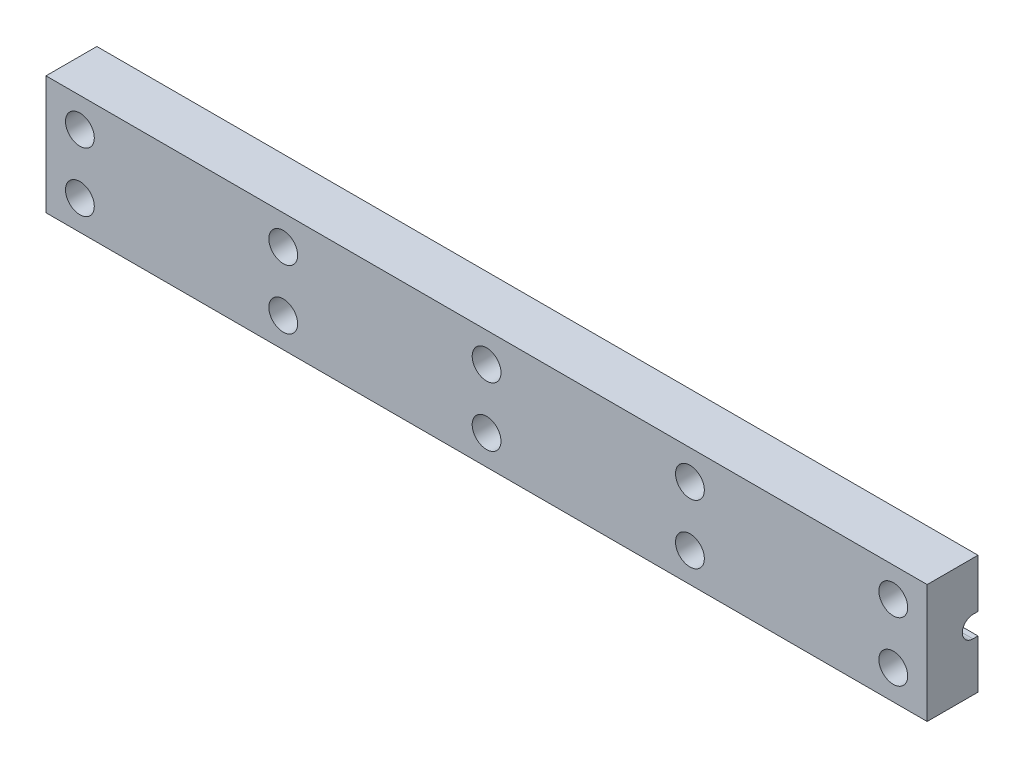
ISO-10303-21;
HEADER;
FILE_DESCRIPTION(('STEP AP214'),'2;1');
FILE_NAME('part.step','',(''),(''),'','','');
FILE_SCHEMA(('AUTOMOTIVE_DESIGN { 1 0 10303 214 1 1 1 1 }'));
ENDSEC;
DATA;
#1=APPLICATION_CONTEXT('core data for automotive mechanical design processes');
#2=APPLICATION_PROTOCOL_DEFINITION('international standard','automotive_design',2000,#1);
#3=PRODUCT_CONTEXT('',#1,'mechanical');
#4=PRODUCT('Part','Part','',(#3));
#5=PRODUCT_RELATED_PRODUCT_CATEGORY('part','',(#4));
#6=PRODUCT_DEFINITION_FORMATION('','',#4);
#7=PRODUCT_DEFINITION_CONTEXT('part definition',#1,'design');
#8=PRODUCT_DEFINITION('design','',#6,#7);
#9=PRODUCT_DEFINITION_SHAPE('','',#8);
#10=(LENGTH_UNIT() NAMED_UNIT(*) SI_UNIT(.MILLI.,.METRE.));
#11=(NAMED_UNIT(*) PLANE_ANGLE_UNIT() SI_UNIT($,.RADIAN.));
#12=(NAMED_UNIT(*) SI_UNIT($,.STERADIAN.) SOLID_ANGLE_UNIT());
#13=UNCERTAINTY_MEASURE_WITH_UNIT(LENGTH_MEASURE(1.E-05),#10,'distance_accuracy_value','');
#14=(GEOMETRIC_REPRESENTATION_CONTEXT(3) GLOBAL_UNCERTAINTY_ASSIGNED_CONTEXT((#13)) GLOBAL_UNIT_ASSIGNED_CONTEXT((#10,
#11,#12)) REPRESENTATION_CONTEXT('',''));
#15=CARTESIAN_POINT('',(0.,0.,0.));
#16=DIRECTION('',(0.,0.,1.));
#17=DIRECTION('',(1.,0.,0.));
#18=AXIS2_PLACEMENT_3D('',#15,#16,#17);
#19=CARTESIAN_POINT('',(170.645147999783,197.163538158501,246.970904960978));
#20=DIRECTION('',(0.,0.,1.));
#21=DIRECTION('',(1.,0.,0.));
#22=AXIS2_PLACEMENT_3D('',#19,#20,#21);
#23=PLANE('',#22);
#24=CARTESIAN_POINT('',(150.645147999783,197.6635381585,246.970904960979));
#25=DIRECTION('',(0.,0.,1.));
#26=DIRECTION('',(1.,0.,0.));
#27=AXIS2_PLACEMENT_3D('',#24,#25,#26);
#28=CIRCLE('',#27,1.70000000000001);
#29=CARTESIAN_POINT('',(152.345147999783,197.6635381585,246.970904960979));
#30=VERTEX_POINT('',#29);
#31=EDGE_CURVE('E223',#30,#30,#28,.T.);
#32=ORIENTED_EDGE('',*,*,#31,.F.);
#33=EDGE_LOOP('',(#32));
#34=FACE_BOUND('',#33,.T.);
#35=CARTESIAN_POINT('',(150.645147999783,204.663538158501,246.970904960979));
#36=DIRECTION('',(0.,0.,1.));
#37=DIRECTION('',(1.,0.,0.));
#38=AXIS2_PLACEMENT_3D('',#35,#36,#37);
#39=CIRCLE('',#38,1.70000000000001);
#40=CARTESIAN_POINT('',(152.345147999783,204.663538158501,246.970904960979));
#41=VERTEX_POINT('',#40);
#42=EDGE_CURVE('E131',#41,#41,#39,.T.);
#43=ORIENTED_EDGE('',*,*,#42,.F.);
#44=EDGE_LOOP('',(#43));
#45=FACE_BOUND('',#44,.T.);
#46=CARTESIAN_POINT('',(222.645147999783,197.663538158501,246.970904960979));
#47=DIRECTION('',(0.,0.,1.));
#48=DIRECTION('',(1.,0.,0.));
#49=AXIS2_PLACEMENT_3D('',#46,#47,#48);
#50=CIRCLE('',#49,1.70000000000001);
#51=CARTESIAN_POINT('',(224.345147999783,197.663538158501,246.970904960979));
#52=VERTEX_POINT('',#51);
#53=EDGE_CURVE('E157',#52,#52,#50,.T.);
#54=ORIENTED_EDGE('',*,*,#53,.F.);
#55=EDGE_LOOP('',(#54));
#56=FACE_BOUND('',#55,.T.);
#57=CARTESIAN_POINT('',(246.645147999783,197.663538158501,246.970904960979));
#58=DIRECTION('',(0.,0.,1.));
#59=DIRECTION('',(1.,0.,0.));
#60=AXIS2_PLACEMENT_3D('',#57,#58,#59);
#61=CIRCLE('',#60,1.70000000000001);
#62=CARTESIAN_POINT('',(248.345147999783,197.663538158501,246.970904960979));
#63=VERTEX_POINT('',#62);
#64=EDGE_CURVE('E161',#63,#63,#61,.T.);
#65=ORIENTED_EDGE('',*,*,#64,.F.);
#66=EDGE_LOOP('',(#65));
#67=FACE_BOUND('',#66,.T.);
#68=CARTESIAN_POINT('',(222.645147999783,204.663538158501,246.970904960979));
#69=DIRECTION('',(0.,0.,1.));
#70=DIRECTION('',(1.,0.,0.));
#71=AXIS2_PLACEMENT_3D('',#68,#69,#70);
#72=CIRCLE('',#71,1.70000000000001);
#73=CARTESIAN_POINT('',(224.345147999783,204.663538158501,246.970904960979));
#74=VERTEX_POINT('',#73);
#75=EDGE_CURVE('E154',#74,#74,#72,.F.);
#76=ORIENTED_EDGE('',*,*,#75,.T.);
#77=EDGE_LOOP('',(#76));
#78=FACE_BOUND('',#77,.T.);
#79=CARTESIAN_POINT('',(246.645147999783,204.663538158501,246.970904960979));
#80=DIRECTION('',(0.,0.,1.));
#81=DIRECTION('',(1.,0.,0.));
#82=AXIS2_PLACEMENT_3D('',#79,#80,#81);
#83=CIRCLE('',#82,1.70000000000001);
#84=CARTESIAN_POINT('',(248.345147999783,204.663538158501,246.970904960979));
#85=VERTEX_POINT('',#84);
#86=EDGE_CURVE('E151',#85,#85,#83,.F.);
#87=ORIENTED_EDGE('',*,*,#86,.T.);
#88=EDGE_LOOP('',(#87));
#89=FACE_BOUND('',#88,.T.);
#90=CARTESIAN_POINT('',(198.645147999783,197.663538158501,246.970904960979));
#91=DIRECTION('',(0.,0.,1.));
#92=DIRECTION('',(1.,0.,0.));
#93=AXIS2_PLACEMENT_3D('',#90,#91,#92);
#94=CIRCLE('',#93,1.70000000000001);
#95=CARTESIAN_POINT('',(200.345147999783,197.663538158501,246.970904960979));
#96=VERTEX_POINT('',#95);
#97=EDGE_CURVE('E160',#96,#96,#94,.T.);
#98=ORIENTED_EDGE('',*,*,#97,.F.);
#99=EDGE_LOOP('',(#98));
#100=FACE_BOUND('',#99,.T.);
#101=DIRECTION('',(1.,0.,0.));
#102=VECTOR('',#101,1.);
#103=CARTESIAN_POINT('',(170.645147999783,194.163538158501,246.970904960978));
#104=LINE('',#103,#102);
#105=CARTESIAN_POINT('',(146.645147999783,194.163538158501,246.970904960978));
#106=VERTEX_POINT('',#105);
#107=CARTESIAN_POINT('',(250.645147999783,194.163538158501,246.970904960978));
#108=VERTEX_POINT('',#107);
#109=EDGE_CURVE('E113',#106,#108,#104,.T.);
#110=ORIENTED_EDGE('',*,*,#109,.T.);
#111=DIRECTION('',(0.,-1.,0.));
#112=VECTOR('',#111,1.);
#113=CARTESIAN_POINT('',(250.645147999783,208.163538158501,246.970904960978));
#114=LINE('',#113,#112);
#115=CARTESIAN_POINT('',(250.645147999783,208.163538158501,246.970904960978));
#116=VERTEX_POINT('',#115);
#117=EDGE_CURVE('E109',#116,#108,#114,.T.);
#118=ORIENTED_EDGE('',*,*,#117,.F.);
#119=DIRECTION('',(1.,0.,0.));
#120=VECTOR('',#119,1.);
#121=CARTESIAN_POINT('',(170.645147999783,208.163538158501,246.970904960978));
#122=LINE('',#121,#120);
#123=CARTESIAN_POINT('',(146.645147999783,208.163538158501,246.970904960978));
#124=VERTEX_POINT('',#123);
#125=EDGE_CURVE('E103',#124,#116,#122,.T.);
#126=ORIENTED_EDGE('',*,*,#125,.F.);
#127=DIRECTION('',(0.,1.,0.));
#128=VECTOR('',#127,1.);
#129=CARTESIAN_POINT('',(146.645147999783,194.163538158501,246.970904960978));
#130=LINE('',#129,#128);
#131=EDGE_CURVE('E107',#106,#124,#130,.T.);
#132=ORIENTED_EDGE('',*,*,#131,.F.);
#133=EDGE_LOOP('',(#110,#118,#126,#132));
#134=FACE_BOUND('',#133,.T.);
#135=CARTESIAN_POINT('',(174.645147999783,197.6635381585,246.970904960979));
#136=DIRECTION('',(0.,0.,1.));
#137=DIRECTION('',(1.,0.,0.));
#138=AXIS2_PLACEMENT_3D('',#135,#136,#137);
#139=CIRCLE('',#138,1.70000000000001);
#140=CARTESIAN_POINT('',(176.345147999783,197.6635381585,246.970904960979));
#141=VERTEX_POINT('',#140);
#142=EDGE_CURVE('E150',#141,#141,#139,.T.);
#143=ORIENTED_EDGE('',*,*,#142,.F.);
#144=EDGE_LOOP('',(#143));
#145=FACE_BOUND('',#144,.T.);
#146=CARTESIAN_POINT('',(198.645147999783,204.663538158501,246.970904960979));
#147=DIRECTION('',(0.,0.,-1.));
#148=DIRECTION('',(-1.,0.,0.));
#149=AXIS2_PLACEMENT_3D('',#146,#147,#148);
#150=CIRCLE('',#149,1.70000000000001);
#151=CARTESIAN_POINT('',(196.945147999783,204.663538158501,246.970904960979));
#152=VERTEX_POINT('',#151);
#153=EDGE_CURVE('E147',#152,#152,#150,.T.);
#154=ORIENTED_EDGE('',*,*,#153,.T.);
#155=EDGE_LOOP('',(#154));
#156=FACE_BOUND('',#155,.T.);
#157=CARTESIAN_POINT('',(174.645147999783,204.663538158501,246.970904960979));
#158=DIRECTION('',(0.,0.,1.));
#159=DIRECTION('',(1.,0.,0.));
#160=AXIS2_PLACEMENT_3D('',#157,#158,#159);
#161=CIRCLE('',#160,1.70000000000001);
#162=CARTESIAN_POINT('',(176.345147999783,204.663538158501,246.970904960979));
#163=VERTEX_POINT('',#162);
#164=EDGE_CURVE('E164',#163,#163,#161,.F.);
#165=ORIENTED_EDGE('',*,*,#164,.T.);
#166=EDGE_LOOP('',(#165));
#167=FACE_BOUND('',#166,.T.);
#168=ADVANCED_FACE('F37',(#34,#45,#56,#67,#78,#89,#100,#134,#145,#156,#167),#23,.T.);
#169=CARTESIAN_POINT('',(170.645147999783,208.163538158501,240.970904960978));
#170=DIRECTION('',(0.,1.,0.));
#171=DIRECTION('',(0.,0.,1.));
#172=AXIS2_PLACEMENT_3D('',#169,#170,#171);
#173=PLANE('',#172);
#174=ORIENTED_EDGE('',*,*,#125,.T.);
#175=DIRECTION('',(0.,0.,1.));
#176=VECTOR('',#175,1.);
#177=CARTESIAN_POINT('',(250.645147999783,208.163538158501,240.970904960978));
#178=LINE('',#177,#176);
#179=CARTESIAN_POINT('',(250.645147999783,208.163538158501,240.970904960978));
#180=VERTEX_POINT('',#179);
#181=EDGE_CURVE('E195',#180,#116,#178,.T.);
#182=ORIENTED_EDGE('',*,*,#181,.F.);
#183=DIRECTION('',(1.,0.,0.));
#184=VECTOR('',#183,1.);
#185=CARTESIAN_POINT('',(170.645147999783,208.163538158501,240.970904960978));
#186=LINE('',#185,#184);
#187=CARTESIAN_POINT('',(146.645147999783,208.163538158501,240.970904960978));
#188=VERTEX_POINT('',#187);
#189=EDGE_CURVE('E11',#188,#180,#186,.T.);
#190=ORIENTED_EDGE('',*,*,#189,.F.);
#191=DIRECTION('',(0.,0.,-1.));
#192=VECTOR('',#191,1.);
#193=CARTESIAN_POINT('',(146.645147999783,208.163538158501,246.970904960978));
#194=LINE('',#193,#192);
#195=EDGE_CURVE('E117',#124,#188,#194,.T.);
#196=ORIENTED_EDGE('',*,*,#195,.F.);
#197=EDGE_LOOP('',(#174,#182,#190,#196));
#198=FACE_BOUND('',#197,.T.);
#199=ADVANCED_FACE('F39',(#198),#173,.T.);
#200=CARTESIAN_POINT('',(170.645147999783,205.163538158501,240.970904960978));
#201=DIRECTION('',(0.,0.,-1.));
#202=DIRECTION('',(-1.,0.,0.));
#203=AXIS2_PLACEMENT_3D('',#200,#201,#202);
#204=PLANE('',#203);
#205=CARTESIAN_POINT('',(150.645147999783,204.663538158501,240.970904960978));
#206=DIRECTION('',(0.,0.,-1.));
#207=DIRECTION('',(-1.,0.,0.));
#208=AXIS2_PLACEMENT_3D('',#205,#206,#207);
#209=CIRCLE('',#208,1.70000000000001);
#210=CARTESIAN_POINT('',(148.945147999783,204.663538158501,240.970904960978));
#211=VERTEX_POINT('',#210);
#212=EDGE_CURVE('E41',#211,#211,#209,.T.);
#213=ORIENTED_EDGE('',*,*,#212,.F.);
#214=EDGE_LOOP('',(#213));
#215=FACE_BOUND('',#214,.T.);
#216=CARTESIAN_POINT('',(174.645147999783,204.663538158501,240.970904960978));
#217=DIRECTION('',(0.,0.,-1.));
#218=DIRECTION('',(-1.,0.,0.));
#219=AXIS2_PLACEMENT_3D('',#216,#217,#218);
#220=CIRCLE('',#219,1.70000000000001);
#221=CARTESIAN_POINT('',(172.945147999783,204.663538158501,240.970904960978));
#222=VERTEX_POINT('',#221);
#223=EDGE_CURVE('E186',#222,#222,#220,.F.);
#224=ORIENTED_EDGE('',*,*,#223,.T.);
#225=EDGE_LOOP('',(#224));
#226=FACE_BOUND('',#225,.T.);
#227=CARTESIAN_POINT('',(222.645147999783,204.663538158501,240.970904960978));
#228=DIRECTION('',(0.,0.,-1.));
#229=DIRECTION('',(-1.,0.,0.));
#230=AXIS2_PLACEMENT_3D('',#227,#228,#229);
#231=CIRCLE('',#230,1.70000000000001);
#232=CARTESIAN_POINT('',(220.945147999783,204.663538158501,240.970904960978));
#233=VERTEX_POINT('',#232);
#234=EDGE_CURVE('E183',#233,#233,#231,.F.);
#235=ORIENTED_EDGE('',*,*,#234,.T.);
#236=EDGE_LOOP('',(#235));
#237=FACE_BOUND('',#236,.T.);
#238=CARTESIAN_POINT('',(198.645147999783,204.663538158501,240.970904960978));
#239=DIRECTION('',(0.,0.,-1.));
#240=DIRECTION('',(-1.,0.,0.));
#241=AXIS2_PLACEMENT_3D('',#238,#239,#240);
#242=CIRCLE('',#241,1.70000000000001);
#243=CARTESIAN_POINT('',(196.945147999783,204.663538158501,240.970904960978));
#244=VERTEX_POINT('',#243);
#245=EDGE_CURVE('E180',#244,#244,#242,.F.);
#246=ORIENTED_EDGE('',*,*,#245,.T.);
#247=EDGE_LOOP('',(#246));
#248=FACE_BOUND('',#247,.T.);
#249=CARTESIAN_POINT('',(246.645147999783,204.663538158501,240.970904960978));
#250=DIRECTION('',(0.,0.,-1.));
#251=DIRECTION('',(-1.,0.,0.));
#252=AXIS2_PLACEMENT_3D('',#249,#250,#251);
#253=CIRCLE('',#252,1.70000000000001);
#254=CARTESIAN_POINT('',(244.945147999783,204.663538158501,240.970904960978));
#255=VERTEX_POINT('',#254);
#256=EDGE_CURVE('E174',#255,#255,#253,.F.);
#257=ORIENTED_EDGE('',*,*,#256,.T.);
#258=EDGE_LOOP('',(#257));
#259=FACE_BOUND('',#258,.T.);
#260=ORIENTED_EDGE('',*,*,#189,.T.);
#261=DIRECTION('',(0.,1.,0.));
#262=VECTOR('',#261,1.);
#263=CARTESIAN_POINT('',(250.645147999783,202.413538158492,240.970904960978));
#264=LINE('',#263,#262);
#265=CARTESIAN_POINT('',(250.645147999783,202.413538158492,240.970904960978));
#266=VERTEX_POINT('',#265);
#267=EDGE_CURVE('E114',#266,#180,#264,.T.);
#268=ORIENTED_EDGE('',*,*,#267,.F.);
#269=DIRECTION('',(1.,0.,0.));
#270=VECTOR('',#269,1.);
#271=CARTESIAN_POINT('',(170.645147999783,202.413538158492,240.970904960978));
#272=LINE('',#271,#270);
#273=CARTESIAN_POINT('',(146.645147999783,202.413538158492,240.970904960978));
#274=VERTEX_POINT('',#273);
#275=EDGE_CURVE('E46',#274,#266,#272,.T.);
#276=ORIENTED_EDGE('',*,*,#275,.F.);
#277=DIRECTION('',(0.,-1.,0.));
#278=VECTOR('',#277,1.);
#279=CARTESIAN_POINT('',(146.645147999783,208.163538158501,240.970904960978));
#280=LINE('',#279,#278);
#281=EDGE_CURVE('E120',#188,#274,#280,.T.);
#282=ORIENTED_EDGE('',*,*,#281,.F.);
#283=EDGE_LOOP('',(#260,#268,#276,#282));
#284=FACE_BOUND('',#283,.T.);
#285=ADVANCED_FACE('F267',(#215,#226,#237,#248,#259,#284),#204,.T.);
#286=CARTESIAN_POINT('',(170.645147999783,202.413538158492,241.570904954906));
#287=DIRECTION('',(0.,-1.,0.));
#288=DIRECTION('',(0.,0.,-1.));
#289=AXIS2_PLACEMENT_3D('',#286,#287,#288);
#290=PLANE('',#289);
#291=ORIENTED_EDGE('',*,*,#275,.T.);
#292=DIRECTION('',(0.,0.,-1.));
#293=VECTOR('',#292,1.);
#294=CARTESIAN_POINT('',(250.645147999783,202.413538158492,241.570904954906));
#295=LINE('',#294,#293);
#296=CARTESIAN_POINT('',(250.645147999783,202.413538158492,241.570904954906));
#297=VERTEX_POINT('',#296);
#298=EDGE_CURVE('E210',#297,#266,#295,.T.);
#299=ORIENTED_EDGE('',*,*,#298,.F.);
#300=DIRECTION('',(1.,0.,0.));
#301=VECTOR('',#300,1.);
#302=CARTESIAN_POINT('',(170.645147999783,202.413538158492,241.570904954906));
#303=LINE('',#302,#301);
#304=CARTESIAN_POINT('',(146.645147999783,202.413538158492,241.570904954906));
#305=VERTEX_POINT('',#304);
#306=EDGE_CURVE('E214',#305,#297,#303,.T.);
#307=ORIENTED_EDGE('',*,*,#306,.F.);
#308=DIRECTION('',(0.,0.,1.));
#309=VECTOR('',#308,1.);
#310=CARTESIAN_POINT('',(146.645147999783,202.413538158492,240.970904960978));
#311=LINE('',#310,#309);
#312=EDGE_CURVE('E135',#274,#305,#311,.T.);
#313=ORIENTED_EDGE('',*,*,#312,.F.);
#314=EDGE_LOOP('',(#291,#299,#307,#313));
#315=FACE_BOUND('',#314,.T.);
#316=ADVANCED_FACE('F270',(#315),#290,.T.);
#317=CARTESIAN_POINT('',(170.645147999783,201.163538158492,241.570904960977));
#318=DIRECTION('',(1.,0.,0.));
#319=DIRECTION('',(0.,0.,-1.));
#320=AXIS2_PLACEMENT_3D('',#317,#318,#319);
#321=CYLINDRICAL_SURFACE('',#320,1.25);
#322=ORIENTED_EDGE('',*,*,#306,.T.);
#323=CARTESIAN_POINT('',(250.645147999783,201.163538158492,241.570904960977));
#324=DIRECTION('',(-1.,0.,0.));
#325=DIRECTION('',(0.,0.,-1.));
#326=AXIS2_PLACEMENT_3D('',#323,#324,#325);
#327=CIRCLE('',#326,1.25);
#328=CARTESIAN_POINT('',(250.645147999783,199.913538158492,241.570904960977));
#329=VERTEX_POINT('',#328);
#330=EDGE_CURVE('E207',#329,#297,#327,.T.);
#331=ORIENTED_EDGE('',*,*,#330,.F.);
#332=DIRECTION('',(1.,0.,0.));
#333=VECTOR('',#332,1.);
#334=CARTESIAN_POINT('',(170.645147999783,199.913538158492,241.570904960977));
#335=LINE('',#334,#333);
#336=CARTESIAN_POINT('',(146.645147999783,199.913538158492,241.570904960977));
#337=VERTEX_POINT('',#336);
#338=EDGE_CURVE('E216',#337,#329,#335,.T.);
#339=ORIENTED_EDGE('',*,*,#338,.F.);
#340=CARTESIAN_POINT('',(146.645147999783,201.163538158492,241.570904960977));
#341=DIRECTION('',(1.,0.,0.));
#342=DIRECTION('',(0.,0.,1.));
#343=AXIS2_PLACEMENT_3D('',#340,#341,#342);
#344=CIRCLE('',#343,1.25);
#345=EDGE_CURVE('E138',#305,#337,#344,.T.);
#346=ORIENTED_EDGE('',*,*,#345,.F.);
#347=EDGE_LOOP('',(#322,#331,#339,#346));
#348=FACE_BOUND('',#347,.T.);
#349=ADVANCED_FACE('F274',(#348),#321,.F.);
#350=CARTESIAN_POINT('',(170.645147999783,199.913538158492,240.970904960978));
#351=DIRECTION('',(0.,1.,0.));
#352=DIRECTION('',(0.,0.,1.));
#353=AXIS2_PLACEMENT_3D('',#350,#351,#352);
#354=PLANE('',#353);
#355=ORIENTED_EDGE('',*,*,#338,.T.);
#356=DIRECTION('',(0.,0.,1.));
#357=VECTOR('',#356,1.);
#358=CARTESIAN_POINT('',(250.645147999783,199.913538158492,240.970904960978));
#359=LINE('',#358,#357);
#360=CARTESIAN_POINT('',(250.645147999783,199.913538158492,240.970904960978));
#361=VERTEX_POINT('',#360);
#362=EDGE_CURVE('E204',#361,#329,#359,.T.);
#363=ORIENTED_EDGE('',*,*,#362,.F.);
#364=DIRECTION('',(1.,0.,0.));
#365=VECTOR('',#364,1.);
#366=CARTESIAN_POINT('',(170.645147999783,199.913538158492,240.970904960978));
#367=LINE('',#366,#365);
#368=CARTESIAN_POINT('',(146.645147999783,199.913538158492,240.970904960978));
#369=VERTEX_POINT('',#368);
#370=EDGE_CURVE('E218',#369,#361,#367,.T.);
#371=ORIENTED_EDGE('',*,*,#370,.F.);
#372=DIRECTION('',(0.,0.,-1.));
#373=VECTOR('',#372,1.);
#374=CARTESIAN_POINT('',(146.645147999783,199.913538158492,241.570904960977));
#375=LINE('',#374,#373);
#376=EDGE_CURVE('E141',#337,#369,#375,.T.);
#377=ORIENTED_EDGE('',*,*,#376,.F.);
#378=EDGE_LOOP('',(#355,#363,#371,#377));
#379=FACE_BOUND('',#378,.T.);
#380=ADVANCED_FACE('F277',(#379),#354,.T.);
#381=CARTESIAN_POINT('',(170.645147999783,197.163538158501,240.970904960978));
#382=DIRECTION('',(0.,0.,-1.));
#383=DIRECTION('',(-1.,0.,0.));
#384=AXIS2_PLACEMENT_3D('',#381,#382,#383);
#385=PLANE('',#384);
#386=CARTESIAN_POINT('',(150.645147999783,197.6635381585,240.970904960978));
#387=DIRECTION('',(0.,0.,-1.));
#388=DIRECTION('',(-1.,0.,0.));
#389=AXIS2_PLACEMENT_3D('',#386,#387,#388);
#390=CIRCLE('',#389,1.70000000000001);
#391=CARTESIAN_POINT('',(148.945147999783,197.6635381585,240.970904960978));
#392=VERTEX_POINT('',#391);
#393=EDGE_CURVE('E129',#392,#392,#390,.T.);
#394=ORIENTED_EDGE('',*,*,#393,.F.);
#395=EDGE_LOOP('',(#394));
#396=FACE_BOUND('',#395,.T.);
#397=CARTESIAN_POINT('',(222.645147999783,197.663538158501,240.970904960978));
#398=DIRECTION('',(0.,0.,-1.));
#399=DIRECTION('',(-1.,0.,0.));
#400=AXIS2_PLACEMENT_3D('',#397,#398,#399);
#401=CIRCLE('',#400,1.70000000000001);
#402=CARTESIAN_POINT('',(220.945147999783,197.663538158501,240.970904960978));
#403=VERTEX_POINT('',#402);
#404=EDGE_CURVE('E192',#403,#403,#401,.T.);
#405=ORIENTED_EDGE('',*,*,#404,.F.);
#406=EDGE_LOOP('',(#405));
#407=FACE_BOUND('',#406,.T.);
#408=CARTESIAN_POINT('',(246.645147999783,197.663538158501,240.970904960978));
#409=DIRECTION('',(0.,0.,-1.));
#410=DIRECTION('',(-1.,0.,0.));
#411=AXIS2_PLACEMENT_3D('',#408,#409,#410);
#412=CIRCLE('',#411,1.70000000000001);
#413=CARTESIAN_POINT('',(244.945147999783,197.663538158501,240.970904960978));
#414=VERTEX_POINT('',#413);
#415=EDGE_CURVE('E189',#414,#414,#412,.T.);
#416=ORIENTED_EDGE('',*,*,#415,.F.);
#417=EDGE_LOOP('',(#416));
#418=FACE_BOUND('',#417,.T.);
#419=CARTESIAN_POINT('',(174.645147999783,197.6635381585,240.970904960978));
#420=DIRECTION('',(0.,0.,-1.));
#421=DIRECTION('',(-1.,0.,0.));
#422=AXIS2_PLACEMENT_3D('',#419,#420,#421);
#423=CIRCLE('',#422,1.70000000000001);
#424=CARTESIAN_POINT('',(172.945147999783,197.6635381585,240.970904960978));
#425=VERTEX_POINT('',#424);
#426=EDGE_CURVE('E177',#425,#425,#423,.T.);
#427=ORIENTED_EDGE('',*,*,#426,.F.);
#428=EDGE_LOOP('',(#427));
#429=FACE_BOUND('',#428,.T.);
#430=CARTESIAN_POINT('',(198.645147999783,197.663538158501,240.970904960978));
#431=DIRECTION('',(0.,0.,-1.));
#432=DIRECTION('',(-1.,0.,0.));
#433=AXIS2_PLACEMENT_3D('',#430,#431,#432);
#434=CIRCLE('',#433,1.70000000000001);
#435=CARTESIAN_POINT('',(196.945147999783,197.663538158501,240.970904960978));
#436=VERTEX_POINT('',#435);
#437=EDGE_CURVE('E171',#436,#436,#434,.T.);
#438=ORIENTED_EDGE('',*,*,#437,.F.);
#439=EDGE_LOOP('',(#438));
#440=FACE_BOUND('',#439,.T.);
#441=ORIENTED_EDGE('',*,*,#370,.T.);
#442=DIRECTION('',(0.,1.,0.));
#443=VECTOR('',#442,1.);
#444=CARTESIAN_POINT('',(250.645147999783,194.163538158501,240.970904960978));
#445=LINE('',#444,#443);
#446=CARTESIAN_POINT('',(250.645147999783,194.163538158501,240.970904960978));
#447=VERTEX_POINT('',#446);
#448=EDGE_CURVE('E201',#447,#361,#445,.T.);
#449=ORIENTED_EDGE('',*,*,#448,.F.);
#450=DIRECTION('',(1.,0.,0.));
#451=VECTOR('',#450,1.);
#452=CARTESIAN_POINT('',(170.645147999783,194.163538158501,240.970904960978));
#453=LINE('',#452,#451);
#454=CARTESIAN_POINT('',(146.645147999783,194.163538158501,240.970904960978));
#455=VERTEX_POINT('',#454);
#456=EDGE_CURVE('E220',#455,#447,#453,.T.);
#457=ORIENTED_EDGE('',*,*,#456,.F.);
#458=DIRECTION('',(0.,-1.,0.));
#459=VECTOR('',#458,1.);
#460=CARTESIAN_POINT('',(146.645147999783,199.913538158492,240.970904960978));
#461=LINE('',#460,#459);
#462=EDGE_CURVE('E144',#369,#455,#461,.T.);
#463=ORIENTED_EDGE('',*,*,#462,.F.);
#464=EDGE_LOOP('',(#441,#449,#457,#463));
#465=FACE_BOUND('',#464,.T.);
#466=ADVANCED_FACE('F281',(#396,#407,#418,#429,#440,#465),#385,.T.);
#467=CARTESIAN_POINT('',(170.645147999783,194.163538158501,246.970904960978));
#468=DIRECTION('',(0.,-1.,0.));
#469=DIRECTION('',(0.,0.,-1.));
#470=AXIS2_PLACEMENT_3D('',#467,#468,#469);
#471=PLANE('',#470);
#472=ORIENTED_EDGE('',*,*,#456,.T.);
#473=DIRECTION('',(0.,0.,-1.));
#474=VECTOR('',#473,1.);
#475=CARTESIAN_POINT('',(250.645147999783,194.163538158501,246.970904960978));
#476=LINE('',#475,#474);
#477=EDGE_CURVE('E198',#108,#447,#476,.T.);
#478=ORIENTED_EDGE('',*,*,#477,.F.);
#479=ORIENTED_EDGE('',*,*,#109,.F.);
#480=DIRECTION('',(0.,0.,1.));
#481=VECTOR('',#480,1.);
#482=CARTESIAN_POINT('',(146.645147999783,194.163538158501,240.970904960978));
#483=LINE('',#482,#481);
#484=EDGE_CURVE('E126',#455,#106,#483,.T.);
#485=ORIENTED_EDGE('',*,*,#484,.F.);
#486=EDGE_LOOP('',(#472,#478,#479,#485));
#487=FACE_BOUND('',#486,.T.);
#488=ADVANCED_FACE('F260',(#487),#471,.T.);
#489=CARTESIAN_POINT('',(250.645147999783,201.163538158492,241.570904960977));
#490=DIRECTION('',(1.,0.,0.));
#491=DIRECTION('',(0.,0.,-1.));
#492=AXIS2_PLACEMENT_3D('',#489,#490,#491);
#493=PLANE('',#492);
#494=ORIENTED_EDGE('',*,*,#181,.T.);
#495=ORIENTED_EDGE('',*,*,#117,.T.);
#496=ORIENTED_EDGE('',*,*,#477,.T.);
#497=ORIENTED_EDGE('',*,*,#448,.T.);
#498=ORIENTED_EDGE('',*,*,#362,.T.);
#499=ORIENTED_EDGE('',*,*,#330,.T.);
#500=ORIENTED_EDGE('',*,*,#298,.T.);
#501=ORIENTED_EDGE('',*,*,#267,.T.);
#502=EDGE_LOOP('',(#494,#495,#496,#497,#498,#499,#500,#501));
#503=FACE_BOUND('',#502,.T.);
#504=ADVANCED_FACE('F250',(#503),#493,.T.);
#505=CARTESIAN_POINT('',(198.645147999783,197.663538158501,236.970904960979));
#506=DIRECTION('',(0.,0.,1.));
#507=DIRECTION('',(1.,0.,0.));
#508=AXIS2_PLACEMENT_3D('',#505,#506,#507);
#509=CYLINDRICAL_SURFACE('',#508,1.70000000000001);
#510=ORIENTED_EDGE('',*,*,#437,.T.);
#511=EDGE_LOOP('',(#510));
#512=FACE_BOUND('',#511,.T.);
#513=ORIENTED_EDGE('',*,*,#97,.T.);
#514=EDGE_LOOP('',(#513));
#515=FACE_BOUND('',#514,.T.);
#516=ADVANCED_FACE('F247',(#512,#515),#509,.F.);
#517=CARTESIAN_POINT('',(246.645147999783,204.663538158501,236.970904960979));
#518=DIRECTION('',(0.,0.,1.));
#519=DIRECTION('',(1.,0.,0.));
#520=AXIS2_PLACEMENT_3D('',#517,#518,#519);
#521=CYLINDRICAL_SURFACE('',#520,1.70000000000001);
#522=ORIENTED_EDGE('',*,*,#256,.F.);
#523=EDGE_LOOP('',(#522));
#524=FACE_BOUND('',#523,.T.);
#525=ORIENTED_EDGE('',*,*,#86,.F.);
#526=EDGE_LOOP('',(#525));
#527=FACE_BOUND('',#526,.T.);
#528=ADVANCED_FACE('F249',(#524,#527),#521,.F.);
#529=CARTESIAN_POINT('',(174.645147999783,197.6635381585,236.970904960979));
#530=DIRECTION('',(0.,0.,1.));
#531=DIRECTION('',(1.,0.,0.));
#532=AXIS2_PLACEMENT_3D('',#529,#530,#531);
#533=CYLINDRICAL_SURFACE('',#532,1.70000000000001);
#534=ORIENTED_EDGE('',*,*,#426,.T.);
#535=EDGE_LOOP('',(#534));
#536=FACE_BOUND('',#535,.T.);
#537=ORIENTED_EDGE('',*,*,#142,.T.);
#538=EDGE_LOOP('',(#537));
#539=FACE_BOUND('',#538,.T.);
#540=ADVANCED_FACE('F257',(#536,#539),#533,.F.);
#541=CARTESIAN_POINT('',(198.645147999783,204.663538158501,236.970904960979));
#542=DIRECTION('',(0.,0.,1.));
#543=DIRECTION('',(1.,0.,0.));
#544=AXIS2_PLACEMENT_3D('',#541,#542,#543);
#545=CYLINDRICAL_SURFACE('',#544,1.70000000000001);
#546=ORIENTED_EDGE('',*,*,#245,.F.);
#547=EDGE_LOOP('',(#546));
#548=FACE_BOUND('',#547,.T.);
#549=ORIENTED_EDGE('',*,*,#153,.F.);
#550=EDGE_LOOP('',(#549));
#551=FACE_BOUND('',#550,.T.);
#552=ADVANCED_FACE('F328',(#548,#551),#545,.F.);
#553=CARTESIAN_POINT('',(222.645147999783,204.663538158501,236.970904960979));
#554=DIRECTION('',(0.,0.,1.));
#555=DIRECTION('',(1.,0.,0.));
#556=AXIS2_PLACEMENT_3D('',#553,#554,#555);
#557=CYLINDRICAL_SURFACE('',#556,1.70000000000001);
#558=ORIENTED_EDGE('',*,*,#234,.F.);
#559=EDGE_LOOP('',(#558));
#560=FACE_BOUND('',#559,.T.);
#561=ORIENTED_EDGE('',*,*,#75,.F.);
#562=EDGE_LOOP('',(#561));
#563=FACE_BOUND('',#562,.T.);
#564=ADVANCED_FACE('F264',(#560,#563),#557,.F.);
#565=CARTESIAN_POINT('',(174.645147999783,204.663538158501,236.970904960979));
#566=DIRECTION('',(0.,0.,1.));
#567=DIRECTION('',(1.,0.,0.));
#568=AXIS2_PLACEMENT_3D('',#565,#566,#567);
#569=CYLINDRICAL_SURFACE('',#568,1.70000000000001);
#570=ORIENTED_EDGE('',*,*,#223,.F.);
#571=EDGE_LOOP('',(#570));
#572=FACE_BOUND('',#571,.T.);
#573=ORIENTED_EDGE('',*,*,#164,.F.);
#574=EDGE_LOOP('',(#573));
#575=FACE_BOUND('',#574,.T.);
#576=ADVANCED_FACE('F347',(#572,#575),#569,.F.);
#577=CARTESIAN_POINT('',(246.645147999783,197.663538158501,236.970904960979));
#578=DIRECTION('',(0.,0.,1.));
#579=DIRECTION('',(1.,0.,0.));
#580=AXIS2_PLACEMENT_3D('',#577,#578,#579);
#581=CYLINDRICAL_SURFACE('',#580,1.70000000000001);
#582=ORIENTED_EDGE('',*,*,#415,.T.);
#583=EDGE_LOOP('',(#582));
#584=FACE_BOUND('',#583,.T.);
#585=ORIENTED_EDGE('',*,*,#64,.T.);
#586=EDGE_LOOP('',(#585));
#587=FACE_BOUND('',#586,.T.);
#588=ADVANCED_FACE('F356',(#584,#587),#581,.F.);
#589=CARTESIAN_POINT('',(222.645147999783,197.663538158501,236.970904960979));
#590=DIRECTION('',(0.,0.,1.));
#591=DIRECTION('',(1.,0.,0.));
#592=AXIS2_PLACEMENT_3D('',#589,#590,#591);
#593=CYLINDRICAL_SURFACE('',#592,1.70000000000001);
#594=ORIENTED_EDGE('',*,*,#404,.T.);
#595=EDGE_LOOP('',(#594));
#596=FACE_BOUND('',#595,.T.);
#597=ORIENTED_EDGE('',*,*,#53,.T.);
#598=EDGE_LOOP('',(#597));
#599=FACE_BOUND('',#598,.T.);
#600=ADVANCED_FACE('F365',(#596,#599),#593,.F.);
#601=CARTESIAN_POINT('',(146.645147999783,201.163538158492,241.570904960977));
#602=DIRECTION('',(-1.,0.,0.));
#603=DIRECTION('',(0.,0.,1.));
#604=AXIS2_PLACEMENT_3D('',#601,#602,#603);
#605=PLANE('',#604);
#606=ORIENTED_EDGE('',*,*,#131,.T.);
#607=ORIENTED_EDGE('',*,*,#195,.T.);
#608=ORIENTED_EDGE('',*,*,#281,.T.);
#609=ORIENTED_EDGE('',*,*,#312,.T.);
#610=ORIENTED_EDGE('',*,*,#345,.T.);
#611=ORIENTED_EDGE('',*,*,#376,.T.);
#612=ORIENTED_EDGE('',*,*,#462,.T.);
#613=ORIENTED_EDGE('',*,*,#484,.T.);
#614=EDGE_LOOP('',(#606,#607,#608,#609,#610,#611,#612,#613));
#615=FACE_BOUND('',#614,.T.);
#616=ADVANCED_FACE('F123',(#615),#605,.T.);
#617=CARTESIAN_POINT('',(150.645147999783,197.6635381585,222.970904960979));
#618=DIRECTION('',(0.,0.,1.));
#619=DIRECTION('',(1.,0.,0.));
#620=AXIS2_PLACEMENT_3D('',#617,#618,#619);
#621=CYLINDRICAL_SURFACE('',#620,1.70000000000001);
#622=ORIENTED_EDGE('',*,*,#393,.T.);
#623=EDGE_LOOP('',(#622));
#624=FACE_BOUND('',#623,.T.);
#625=ORIENTED_EDGE('',*,*,#31,.T.);
#626=EDGE_LOOP('',(#625));
#627=FACE_BOUND('',#626,.T.);
#628=ADVANCED_FACE('F430',(#624,#627),#621,.F.);
#629=CARTESIAN_POINT('',(150.645147999783,204.663538158501,222.970904960979));
#630=DIRECTION('',(0.,0.,1.));
#631=DIRECTION('',(1.,0.,0.));
#632=AXIS2_PLACEMENT_3D('',#629,#630,#631);
#633=CYLINDRICAL_SURFACE('',#632,1.70000000000001);
#634=ORIENTED_EDGE('',*,*,#212,.T.);
#635=EDGE_LOOP('',(#634));
#636=FACE_BOUND('',#635,.T.);
#637=ORIENTED_EDGE('',*,*,#42,.T.);
#638=EDGE_LOOP('',(#637));
#639=FACE_BOUND('',#638,.T.);
#640=ADVANCED_FACE('F232',(#636,#639),#633,.F.);
#641=CLOSED_SHELL('',(#168,#199,#285,#316,#349,#380,#466,#488,#504,#516,#528,#540,#552,#564,
#576,#588,#600,#616,#628,#640));
#642=MANIFOLD_SOLID_BREP('B2',#641);
#643=ADVANCED_BREP_SHAPE_REPRESENTATION('',(#18,#642),#14);
#644=SHAPE_DEFINITION_REPRESENTATION(#9,#643);
ENDSEC;
END-ISO-10303-21;
